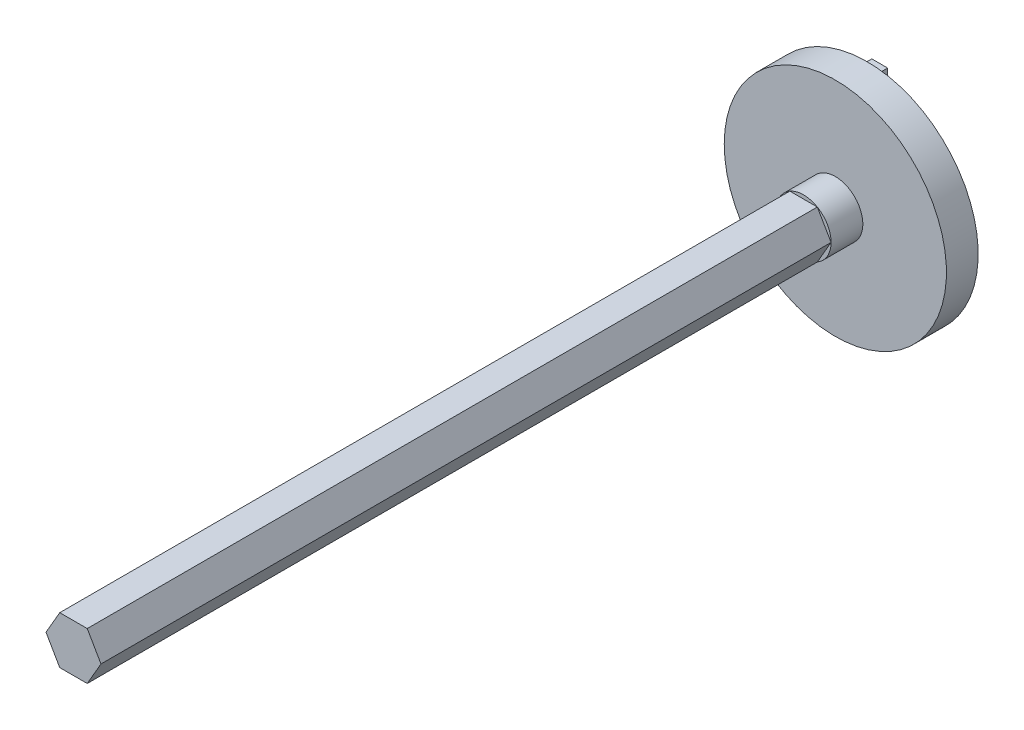
ISO-10303-21;
HEADER;
FILE_DESCRIPTION(('STEP AP214'),'2;1');
FILE_NAME('part.step','',(''),(''),'','','');
FILE_SCHEMA(('AUTOMOTIVE_DESIGN { 1 0 10303 214 1 1 1 1 }'));
ENDSEC;
DATA;
#1=APPLICATION_CONTEXT('core data for automotive mechanical design processes');
#2=APPLICATION_PROTOCOL_DEFINITION('international standard','automotive_design',2000,#1);
#3=PRODUCT_CONTEXT('',#1,'mechanical');
#4=PRODUCT('Part','Part','',(#3));
#5=PRODUCT_RELATED_PRODUCT_CATEGORY('part','',(#4));
#6=PRODUCT_DEFINITION_FORMATION('','',#4);
#7=PRODUCT_DEFINITION_CONTEXT('part definition',#1,'design');
#8=PRODUCT_DEFINITION('design','',#6,#7);
#9=PRODUCT_DEFINITION_SHAPE('','',#8);
#10=(LENGTH_UNIT() NAMED_UNIT(*) SI_UNIT(.MILLI.,.METRE.));
#11=(NAMED_UNIT(*) PLANE_ANGLE_UNIT() SI_UNIT($,.RADIAN.));
#12=(NAMED_UNIT(*) SI_UNIT($,.STERADIAN.) SOLID_ANGLE_UNIT());
#13=UNCERTAINTY_MEASURE_WITH_UNIT(LENGTH_MEASURE(1.E-05),#10,'distance_accuracy_value','');
#14=(GEOMETRIC_REPRESENTATION_CONTEXT(3) GLOBAL_UNCERTAINTY_ASSIGNED_CONTEXT((#13)) GLOBAL_UNIT_ASSIGNED_CONTEXT((#10,
#11,#12)) REPRESENTATION_CONTEXT('',''));
#15=CARTESIAN_POINT('',(0.,0.,0.));
#16=DIRECTION('',(0.,0.,1.));
#17=DIRECTION('',(1.,0.,0.));
#18=AXIS2_PLACEMENT_3D('',#15,#16,#17);
#19=CARTESIAN_POINT('',(0.,0.,-12.7));
#20=DIRECTION('',(0.,0.,-1.));
#21=DIRECTION('',(-1.,0.,0.));
#22=AXIS2_PLACEMENT_3D('',#19,#20,#21);
#23=PLANE('',#22);
#24=CARTESIAN_POINT('',(0.,0.,-12.7));
#25=DIRECTION('',(0.,0.,-1.));
#26=DIRECTION('',(-1.,0.,0.));
#27=AXIS2_PLACEMENT_3D('',#24,#25,#26);
#28=CIRCLE('',#27,44.45);
#29=CARTESIAN_POINT('',(-44.45,0.,-12.7));
#30=VERTEX_POINT('',#29);
#31=EDGE_CURVE('E152',#30,#30,#28,.T.);
#32=ORIENTED_EDGE('',*,*,#31,.T.);
#33=EDGE_LOOP('',(#32));
#34=FACE_BOUND('',#33,.T.);
#35=DIRECTION('',(1.,0.,0.));
#36=VECTOR('',#35,1.);
#37=CARTESIAN_POINT('',(3.17500000000001,41.275,-12.7));
#38=LINE('',#37,#36);
#39=CARTESIAN_POINT('',(-3.17499999999999,41.275,-12.7));
#40=VERTEX_POINT('',#39);
#41=CARTESIAN_POINT('',(3.17500000000001,41.275,-12.7));
#42=VERTEX_POINT('',#41);
#43=EDGE_CURVE('E460',#40,#42,#38,.T.);
#44=ORIENTED_EDGE('',*,*,#43,.F.);
#45=DIRECTION('',(0.,1.,0.));
#46=VECTOR('',#45,1.);
#47=CARTESIAN_POINT('',(-3.17499999999999,41.275,-12.7));
#48=LINE('',#47,#46);
#49=CARTESIAN_POINT('',(-3.17499999999999,34.925,-12.7));
#50=VERTEX_POINT('',#49);
#51=EDGE_CURVE('E144',#50,#40,#48,.T.);
#52=ORIENTED_EDGE('',*,*,#51,.F.);
#53=DIRECTION('',(-1.,0.,0.));
#54=VECTOR('',#53,1.);
#55=CARTESIAN_POINT('',(3.17500000000001,34.925,-12.7));
#56=LINE('',#55,#54);
#57=CARTESIAN_POINT('',(3.17500000000001,34.925,-12.7));
#58=VERTEX_POINT('',#57);
#59=EDGE_CURVE('E140',#58,#50,#56,.T.);
#60=ORIENTED_EDGE('',*,*,#59,.F.);
#61=DIRECTION('',(0.,-1.,0.));
#62=VECTOR('',#61,1.);
#63=CARTESIAN_POINT('',(3.17500000000001,41.275,-12.7));
#64=LINE('',#63,#62);
#65=EDGE_CURVE('E456',#42,#58,#64,.T.);
#66=ORIENTED_EDGE('',*,*,#65,.F.);
#67=EDGE_LOOP('',(#44,#52,#60,#66));
#68=FACE_BOUND('',#67,.T.);
#69=ADVANCED_FACE('F39',(#34,#68),#23,.T.);
#70=CARTESIAN_POINT('',(5.49926131403118,9.525,304.8));
#71=DIRECTION('',(0.,-1.,0.));
#72=DIRECTION('',(0.,0.,-1.));
#73=AXIS2_PLACEMENT_3D('',#70,#71,#72);
#74=PLANE('',#73);
#75=DIRECTION('',(1.,0.,0.));
#76=VECTOR('',#75,1.);
#77=CARTESIAN_POINT('',(5.49926131403118,9.525,12.7));
#78=LINE('',#77,#76);
#79=CARTESIAN_POINT('',(-5.49926131403119,9.525,12.7000000000001));
#80=VERTEX_POINT('',#79);
#81=CARTESIAN_POINT('',(5.49926131403118,9.525,12.7000000000001));
#82=VERTEX_POINT('',#81);
#83=EDGE_CURVE('E63',#80,#82,#78,.T.);
#84=ORIENTED_EDGE('',*,*,#83,.F.);
#85=DIRECTION('',(0.,0.,-1.));
#86=VECTOR('',#85,1.);
#87=CARTESIAN_POINT('',(-5.49926131403119,9.525,304.8));
#88=LINE('',#87,#86);
#89=CARTESIAN_POINT('',(-5.49926131403119,9.525,304.8));
#90=VERTEX_POINT('',#89);
#91=EDGE_CURVE('E48',#90,#80,#88,.T.);
#92=ORIENTED_EDGE('',*,*,#91,.F.);
#93=DIRECTION('',(-1.,0.,0.));
#94=VECTOR('',#93,1.);
#95=CARTESIAN_POINT('',(5.49926131403118,9.525,304.8));
#96=LINE('',#95,#94);
#97=CARTESIAN_POINT('',(5.49926131403118,9.525,304.8));
#98=VERTEX_POINT('',#97);
#99=EDGE_CURVE('E188',#98,#90,#96,.T.);
#100=ORIENTED_EDGE('',*,*,#99,.F.);
#101=DIRECTION('',(0.,0.,-1.));
#102=VECTOR('',#101,1.);
#103=CARTESIAN_POINT('',(5.49926131403118,9.525,304.8));
#104=LINE('',#103,#102);
#105=EDGE_CURVE('E207',#98,#82,#104,.T.);
#106=ORIENTED_EDGE('',*,*,#105,.T.);
#107=EDGE_LOOP('',(#84,#92,#100,#106));
#108=FACE_BOUND('',#107,.T.);
#109=ADVANCED_FACE('F41',(#108),#74,.F.);
#110=CARTESIAN_POINT('',(-5.49926131403119,9.525,304.8));
#111=DIRECTION('',(0.866025403784439,-0.5,0.));
#112=DIRECTION('',(0.5,0.866025403784439,0.));
#113=AXIS2_PLACEMENT_3D('',#110,#111,#112);
#114=PLANE('',#113);
#115=DIRECTION('',(0.5,0.866025403784439,0.));
#116=VECTOR('',#115,1.);
#117=CARTESIAN_POINT('',(-5.49926131403119,9.525,12.7));
#118=LINE('',#117,#116);
#119=CARTESIAN_POINT('',(-10.9985226280624,0.,12.7000000000001));
#120=VERTEX_POINT('',#119);
#121=EDGE_CURVE('E182',#120,#80,#118,.T.);
#122=ORIENTED_EDGE('',*,*,#121,.F.);
#123=DIRECTION('',(0.,0.,-1.));
#124=VECTOR('',#123,1.);
#125=CARTESIAN_POINT('',(-10.9985226280624,0.,304.8));
#126=LINE('',#125,#124);
#127=CARTESIAN_POINT('',(-10.9985226280624,0.,304.8));
#128=VERTEX_POINT('',#127);
#129=EDGE_CURVE('E221',#128,#120,#126,.T.);
#130=ORIENTED_EDGE('',*,*,#129,.F.);
#131=DIRECTION('',(-0.5,-0.866025403784439,0.));
#132=VECTOR('',#131,1.);
#133=CARTESIAN_POINT('',(-5.49926131403119,9.525,304.8));
#134=LINE('',#133,#132);
#135=EDGE_CURVE('E192',#90,#128,#134,.T.);
#136=ORIENTED_EDGE('',*,*,#135,.F.);
#137=ORIENTED_EDGE('',*,*,#91,.T.);
#138=EDGE_LOOP('',(#122,#130,#136,#137));
#139=FACE_BOUND('',#138,.T.);
#140=ADVANCED_FACE('F226',(#139),#114,.F.);
#141=CARTESIAN_POINT('',(-10.9985226280624,0.,304.8));
#142=DIRECTION('',(0.866025403784439,0.5,0.));
#143=DIRECTION('',(-0.5,0.866025403784438,0.));
#144=AXIS2_PLACEMENT_3D('',#141,#142,#143);
#145=PLANE('',#144);
#146=DIRECTION('',(-0.5,0.866025403784438,0.));
#147=VECTOR('',#146,1.);
#148=CARTESIAN_POINT('',(-10.9985226280624,0.,12.7));
#149=LINE('',#148,#147);
#150=CARTESIAN_POINT('',(-5.49926131403118,-9.525,12.7000000000001));
#151=VERTEX_POINT('',#150);
#152=EDGE_CURVE('E178',#151,#120,#149,.T.);
#153=ORIENTED_EDGE('',*,*,#152,.F.);
#154=DIRECTION('',(0.,0.,-1.));
#155=VECTOR('',#154,1.);
#156=CARTESIAN_POINT('',(-5.49926131403118,-9.525,304.8));
#157=LINE('',#156,#155);
#158=CARTESIAN_POINT('',(-5.49926131403118,-9.525,304.8));
#159=VERTEX_POINT('',#158);
#160=EDGE_CURVE('E217',#159,#151,#157,.T.);
#161=ORIENTED_EDGE('',*,*,#160,.F.);
#162=DIRECTION('',(0.5,-0.866025403784439,0.));
#163=VECTOR('',#162,1.);
#164=CARTESIAN_POINT('',(-10.9985226280624,0.,304.8));
#165=LINE('',#164,#163);
#166=EDGE_CURVE('E195',#128,#159,#165,.T.);
#167=ORIENTED_EDGE('',*,*,#166,.F.);
#168=ORIENTED_EDGE('',*,*,#129,.T.);
#169=EDGE_LOOP('',(#153,#161,#167,#168));
#170=FACE_BOUND('',#169,.T.);
#171=ADVANCED_FACE('F279',(#170),#145,.F.);
#172=CARTESIAN_POINT('',(-5.49926131403118,-9.525,304.8));
#173=DIRECTION('',(0.,1.,0.));
#174=DIRECTION('',(0.,0.,1.));
#175=AXIS2_PLACEMENT_3D('',#172,#173,#174);
#176=PLANE('',#175);
#177=DIRECTION('',(-1.,0.,0.));
#178=VECTOR('',#177,1.);
#179=CARTESIAN_POINT('',(-5.49926131403118,-9.525,12.7));
#180=LINE('',#179,#178);
#181=CARTESIAN_POINT('',(5.49926131403119,-9.525,12.7000000000001));
#182=VERTEX_POINT('',#181);
#183=EDGE_CURVE('E174',#182,#151,#180,.T.);
#184=ORIENTED_EDGE('',*,*,#183,.F.);
#185=DIRECTION('',(0.,0.,-1.));
#186=VECTOR('',#185,1.);
#187=CARTESIAN_POINT('',(5.49926131403119,-9.525,304.8));
#188=LINE('',#187,#186);
#189=CARTESIAN_POINT('',(5.49926131403119,-9.525,304.8));
#190=VERTEX_POINT('',#189);
#191=EDGE_CURVE('E213',#190,#182,#188,.T.);
#192=ORIENTED_EDGE('',*,*,#191,.F.);
#193=DIRECTION('',(1.,0.,0.));
#194=VECTOR('',#193,1.);
#195=CARTESIAN_POINT('',(-5.49926131403118,-9.525,304.8));
#196=LINE('',#195,#194);
#197=EDGE_CURVE('E198',#159,#190,#196,.T.);
#198=ORIENTED_EDGE('',*,*,#197,.F.);
#199=ORIENTED_EDGE('',*,*,#160,.T.);
#200=EDGE_LOOP('',(#184,#192,#198,#199));
#201=FACE_BOUND('',#200,.T.);
#202=ADVANCED_FACE('F269',(#201),#176,.F.);
#203=CARTESIAN_POINT('',(5.49926131403119,-9.525,304.8));
#204=DIRECTION('',(-0.866025403784439,0.5,0.));
#205=DIRECTION('',(-0.5,-0.866025403784439,0.));
#206=AXIS2_PLACEMENT_3D('',#203,#204,#205);
#207=PLANE('',#206);
#208=DIRECTION('',(-0.5,-0.866025403784439,0.));
#209=VECTOR('',#208,1.);
#210=CARTESIAN_POINT('',(5.49926131403119,-9.525,12.7));
#211=LINE('',#210,#209);
#212=CARTESIAN_POINT('',(10.9985226280624,0.,12.7));
#213=VERTEX_POINT('',#212);
#214=EDGE_CURVE('E165',#213,#182,#211,.T.);
#215=ORIENTED_EDGE('',*,*,#214,.F.);
#216=DIRECTION('',(0.,0.,-1.));
#217=VECTOR('',#216,1.);
#218=CARTESIAN_POINT('',(10.9985226280624,0.,304.8));
#219=LINE('',#218,#217);
#220=CARTESIAN_POINT('',(10.9985226280624,0.,304.8));
#221=VERTEX_POINT('',#220);
#222=EDGE_CURVE('E210',#221,#213,#219,.T.);
#223=ORIENTED_EDGE('',*,*,#222,.F.);
#224=DIRECTION('',(0.5,0.866025403784439,0.));
#225=VECTOR('',#224,1.);
#226=CARTESIAN_POINT('',(5.49926131403119,-9.525,304.8));
#227=LINE('',#226,#225);
#228=EDGE_CURVE('E201',#190,#221,#227,.T.);
#229=ORIENTED_EDGE('',*,*,#228,.F.);
#230=ORIENTED_EDGE('',*,*,#191,.T.);
#231=EDGE_LOOP('',(#215,#223,#229,#230));
#232=FACE_BOUND('',#231,.T.);
#233=ADVANCED_FACE('F273',(#232),#207,.F.);
#234=CARTESIAN_POINT('',(10.9985226280624,0.,304.8));
#235=DIRECTION('',(-0.866025403784439,-0.5,0.));
#236=DIRECTION('',(0.5,-0.866025403784439,0.));
#237=AXIS2_PLACEMENT_3D('',#234,#235,#236);
#238=PLANE('',#237);
#239=DIRECTION('',(0.5,-0.866025403784439,0.));
#240=VECTOR('',#239,1.);
#241=CARTESIAN_POINT('',(10.9985226280624,0.,12.7));
#242=LINE('',#241,#240);
#243=EDGE_CURVE('E11',#82,#213,#242,.T.);
#244=ORIENTED_EDGE('',*,*,#243,.F.);
#245=ORIENTED_EDGE('',*,*,#105,.F.);
#246=DIRECTION('',(-0.5,0.866025403784439,0.));
#247=VECTOR('',#246,1.);
#248=CARTESIAN_POINT('',(10.9985226280624,0.,304.8));
#249=LINE('',#248,#247);
#250=EDGE_CURVE('E204',#221,#98,#249,.T.);
#251=ORIENTED_EDGE('',*,*,#250,.F.);
#252=ORIENTED_EDGE('',*,*,#222,.T.);
#253=EDGE_LOOP('',(#244,#245,#251,#252));
#254=FACE_BOUND('',#253,.T.);
#255=ADVANCED_FACE('F320',(#254),#238,.F.);
#256=CARTESIAN_POINT('',(0.,0.,304.8));
#257=DIRECTION('',(0.,0.,1.));
#258=DIRECTION('',(1.,0.,0.));
#259=AXIS2_PLACEMENT_3D('',#256,#257,#258);
#260=PLANE('',#259);
#261=ORIENTED_EDGE('',*,*,#99,.T.);
#262=ORIENTED_EDGE('',*,*,#135,.T.);
#263=ORIENTED_EDGE('',*,*,#166,.T.);
#264=ORIENTED_EDGE('',*,*,#197,.T.);
#265=ORIENTED_EDGE('',*,*,#228,.T.);
#266=ORIENTED_EDGE('',*,*,#250,.T.);
#267=EDGE_LOOP('',(#261,#262,#263,#264,#265,#266));
#268=FACE_BOUND('',#267,.T.);
#269=ADVANCED_FACE('F276',(#268),#260,.T.);
#270=CARTESIAN_POINT('',(0.,0.,12.7));
#271=DIRECTION('',(0.,0.,-1.));
#272=DIRECTION('',(-1.,0.,0.));
#273=AXIS2_PLACEMENT_3D('',#270,#271,#272);
#274=PLANE('',#273);
#275=CARTESIAN_POINT('',(0.,0.,12.7));
#276=DIRECTION('',(0.,0.,-1.));
#277=DIRECTION('',(-1.,0.,0.));
#278=AXIS2_PLACEMENT_3D('',#275,#276,#277);
#279=CIRCLE('',#278,10.9985226280624);
#280=EDGE_CURVE('E166',#80,#82,#279,.T.);
#281=ORIENTED_EDGE('',*,*,#280,.F.);
#282=ORIENTED_EDGE('',*,*,#83,.T.);
#283=EDGE_LOOP('',(#281,#282));
#284=FACE_BOUND('',#283,.T.);
#285=ADVANCED_FACE('F235',(#284),#274,.F.);
#286=EDGE_CURVE('E161',#120,#80,#279,.T.);
#287=ORIENTED_EDGE('',*,*,#286,.F.);
#288=ORIENTED_EDGE('',*,*,#121,.T.);
#289=EDGE_LOOP('',(#287,#288));
#290=FACE_BOUND('',#289,.T.);
#291=ADVANCED_FACE('F232',(#290),#274,.F.);
#292=EDGE_CURVE('E167',#151,#120,#279,.T.);
#293=ORIENTED_EDGE('',*,*,#292,.F.);
#294=ORIENTED_EDGE('',*,*,#152,.T.);
#295=EDGE_LOOP('',(#293,#294));
#296=FACE_BOUND('',#295,.T.);
#297=ADVANCED_FACE('F280',(#296),#274,.F.);
#298=EDGE_CURVE('E248',#182,#151,#279,.T.);
#299=ORIENTED_EDGE('',*,*,#298,.F.);
#300=ORIENTED_EDGE('',*,*,#183,.T.);
#301=EDGE_LOOP('',(#299,#300));
#302=FACE_BOUND('',#301,.T.);
#303=ADVANCED_FACE('F266',(#302),#274,.F.);
#304=EDGE_CURVE('E252',#213,#182,#279,.T.);
#305=ORIENTED_EDGE('',*,*,#304,.F.);
#306=ORIENTED_EDGE('',*,*,#214,.T.);
#307=EDGE_LOOP('',(#305,#306));
#308=FACE_BOUND('',#307,.T.);
#309=ADVANCED_FACE('F261',(#308),#274,.F.);
#310=EDGE_CURVE('E240',#82,#213,#279,.T.);
#311=ORIENTED_EDGE('',*,*,#310,.F.);
#312=ORIENTED_EDGE('',*,*,#243,.T.);
#313=EDGE_LOOP('',(#311,#312));
#314=FACE_BOUND('',#313,.T.);
#315=ADVANCED_FACE('F257',(#314),#274,.F.);
#316=CARTESIAN_POINT('',(0.,0.,12.7));
#317=DIRECTION('',(0.,0.,-1.));
#318=DIRECTION('',(-1.,0.,0.));
#319=AXIS2_PLACEMENT_3D('',#316,#317,#318);
#320=CYLINDRICAL_SURFACE('',#319,10.9985226280624);
#321=ORIENTED_EDGE('',*,*,#286,.T.);
#322=ORIENTED_EDGE('',*,*,#280,.T.);
#323=ORIENTED_EDGE('',*,*,#310,.T.);
#324=ORIENTED_EDGE('',*,*,#304,.T.);
#325=ORIENTED_EDGE('',*,*,#298,.T.);
#326=ORIENTED_EDGE('',*,*,#292,.T.);
#327=EDGE_LOOP('',(#321,#322,#323,#324,#325,#326));
#328=FACE_BOUND('',#327,.T.);
#329=CARTESIAN_POINT('',(0.,0.,0.));
#330=DIRECTION('',(0.,0.,-1.));
#331=DIRECTION('',(-1.,0.,0.));
#332=AXIS2_PLACEMENT_3D('',#329,#330,#331);
#333=CIRCLE('',#332,10.9985226280624);
#334=CARTESIAN_POINT('',(-10.9985226280624,0.,0.));
#335=VERTEX_POINT('',#334);
#336=EDGE_CURVE('E159',#335,#335,#333,.T.);
#337=ORIENTED_EDGE('',*,*,#336,.F.);
#338=EDGE_LOOP('',(#337));
#339=FACE_BOUND('',#338,.T.);
#340=ADVANCED_FACE('F242',(#328,#339),#320,.T.);
#341=CARTESIAN_POINT('',(0.,0.,-12.7));
#342=DIRECTION('',(0.,0.,1.));
#343=DIRECTION('',(1.,0.,0.));
#344=AXIS2_PLACEMENT_3D('',#341,#342,#343);
#345=CYLINDRICAL_SURFACE('',#344,44.45);
#346=ORIENTED_EDGE('',*,*,#31,.F.);
#347=EDGE_LOOP('',(#346));
#348=FACE_BOUND('',#347,.T.);
#349=CARTESIAN_POINT('',(0.,0.,0.));
#350=DIRECTION('',(0.,0.,-1.));
#351=DIRECTION('',(-1.,0.,0.));
#352=AXIS2_PLACEMENT_3D('',#349,#350,#351);
#353=CIRCLE('',#352,44.45);
#354=CARTESIAN_POINT('',(-44.45,0.,0.));
#355=VERTEX_POINT('',#354);
#356=EDGE_CURVE('E147',#355,#355,#353,.T.);
#357=ORIENTED_EDGE('',*,*,#356,.T.);
#358=EDGE_LOOP('',(#357));
#359=FACE_BOUND('',#358,.T.);
#360=ADVANCED_FACE('F303',(#348,#359),#345,.T.);
#361=CARTESIAN_POINT('',(0.,0.,0.));
#362=DIRECTION('',(0.,0.,-1.));
#363=DIRECTION('',(-1.,0.,0.));
#364=AXIS2_PLACEMENT_3D('',#361,#362,#363);
#365=PLANE('',#364);
#366=ORIENTED_EDGE('',*,*,#336,.T.);
#367=EDGE_LOOP('',(#366));
#368=FACE_BOUND('',#367,.T.);
#369=ORIENTED_EDGE('',*,*,#356,.F.);
#370=EDGE_LOOP('',(#369));
#371=FACE_BOUND('',#370,.T.);
#372=ADVANCED_FACE('F301',(#368,#371),#365,.F.);
#373=CARTESIAN_POINT('',(-3.17499999999999,41.275,-17.78));
#374=DIRECTION('',(1.,0.,0.));
#375=DIRECTION('',(0.,1.,0.));
#376=AXIS2_PLACEMENT_3D('',#373,#374,#375);
#377=PLANE('',#376);
#378=ORIENTED_EDGE('',*,*,#51,.T.);
#379=DIRECTION('',(0.,0.,1.));
#380=VECTOR('',#379,1.);
#381=CARTESIAN_POINT('',(-3.17499999999999,41.275,-17.78));
#382=LINE('',#381,#380);
#383=CARTESIAN_POINT('',(-3.17499999999999,41.275,-17.78));
#384=VERTEX_POINT('',#383);
#385=EDGE_CURVE('E123',#384,#40,#382,.T.);
#386=ORIENTED_EDGE('',*,*,#385,.F.);
#387=DIRECTION('',(0.,1.,0.));
#388=VECTOR('',#387,1.);
#389=CARTESIAN_POINT('',(-3.17499999999999,41.275,-17.78));
#390=LINE('',#389,#388);
#391=CARTESIAN_POINT('',(-3.17499999999999,34.925,-17.78));
#392=VERTEX_POINT('',#391);
#393=EDGE_CURVE('E131',#392,#384,#390,.T.);
#394=ORIENTED_EDGE('',*,*,#393,.F.);
#395=DIRECTION('',(0.,0.,1.));
#396=VECTOR('',#395,1.);
#397=CARTESIAN_POINT('',(-3.17499999999999,34.925,-17.78));
#398=LINE('',#397,#396);
#399=EDGE_CURVE('E453',#392,#50,#398,.T.);
#400=ORIENTED_EDGE('',*,*,#399,.T.);
#401=EDGE_LOOP('',(#378,#386,#394,#400));
#402=FACE_BOUND('',#401,.T.);
#403=ADVANCED_FACE('F142',(#402),#377,.F.);
#404=CARTESIAN_POINT('',(3.17500000000001,41.275,-17.78));
#405=DIRECTION('',(0.,-1.,0.));
#406=DIRECTION('',(0.,0.,-1.));
#407=AXIS2_PLACEMENT_3D('',#404,#405,#406);
#408=PLANE('',#407);
#409=ORIENTED_EDGE('',*,*,#43,.T.);
#410=DIRECTION('',(0.,0.,1.));
#411=VECTOR('',#410,1.);
#412=CARTESIAN_POINT('',(3.17500000000001,41.275,-17.78));
#413=LINE('',#412,#411);
#414=CARTESIAN_POINT('',(3.17500000000001,41.275,-17.78));
#415=VERTEX_POINT('',#414);
#416=EDGE_CURVE('E126',#415,#42,#413,.T.);
#417=ORIENTED_EDGE('',*,*,#416,.F.);
#418=DIRECTION('',(1.,0.,0.));
#419=VECTOR('',#418,1.);
#420=CARTESIAN_POINT('',(3.17500000000001,41.275,-17.78));
#421=LINE('',#420,#419);
#422=EDGE_CURVE('E119',#384,#415,#421,.T.);
#423=ORIENTED_EDGE('',*,*,#422,.F.);
#424=ORIENTED_EDGE('',*,*,#385,.T.);
#425=EDGE_LOOP('',(#409,#417,#423,#424));
#426=FACE_BOUND('',#425,.T.);
#427=ADVANCED_FACE('F121',(#426),#408,.F.);
#428=CARTESIAN_POINT('',(3.17500000000001,41.275,-17.78));
#429=DIRECTION('',(-1.,0.,0.));
#430=DIRECTION('',(0.,-1.,0.));
#431=AXIS2_PLACEMENT_3D('',#428,#429,#430);
#432=PLANE('',#431);
#433=ORIENTED_EDGE('',*,*,#65,.T.);
#434=DIRECTION('',(0.,0.,1.));
#435=VECTOR('',#434,1.);
#436=CARTESIAN_POINT('',(3.17500000000001,34.925,-17.78));
#437=LINE('',#436,#435);
#438=CARTESIAN_POINT('',(3.17500000000001,34.925,-17.78));
#439=VERTEX_POINT('',#438);
#440=EDGE_CURVE('E55',#439,#58,#437,.T.);
#441=ORIENTED_EDGE('',*,*,#440,.F.);
#442=DIRECTION('',(0.,-1.,0.));
#443=VECTOR('',#442,1.);
#444=CARTESIAN_POINT('',(3.17500000000001,41.275,-17.78));
#445=LINE('',#444,#443);
#446=EDGE_CURVE('E130',#415,#439,#445,.T.);
#447=ORIENTED_EDGE('',*,*,#446,.F.);
#448=ORIENTED_EDGE('',*,*,#416,.T.);
#449=EDGE_LOOP('',(#433,#441,#447,#448));
#450=FACE_BOUND('',#449,.T.);
#451=ADVANCED_FACE('F420',(#450),#432,.F.);
#452=CARTESIAN_POINT('',(3.17500000000001,34.925,-17.78));
#453=DIRECTION('',(0.,1.,0.));
#454=DIRECTION('',(0.,0.,1.));
#455=AXIS2_PLACEMENT_3D('',#452,#453,#454);
#456=PLANE('',#455);
#457=ORIENTED_EDGE('',*,*,#59,.T.);
#458=ORIENTED_EDGE('',*,*,#399,.F.);
#459=DIRECTION('',(-1.,0.,0.));
#460=VECTOR('',#459,1.);
#461=CARTESIAN_POINT('',(3.17500000000001,34.925,-17.78));
#462=LINE('',#461,#460);
#463=EDGE_CURVE('E135',#439,#392,#462,.T.);
#464=ORIENTED_EDGE('',*,*,#463,.F.);
#465=ORIENTED_EDGE('',*,*,#440,.T.);
#466=EDGE_LOOP('',(#457,#458,#464,#465));
#467=FACE_BOUND('',#466,.T.);
#468=ADVANCED_FACE('F426',(#467),#456,.F.);
#469=CARTESIAN_POINT('',(0.,0.,-17.78));
#470=DIRECTION('',(0.,0.,-1.));
#471=DIRECTION('',(-1.,0.,0.));
#472=AXIS2_PLACEMENT_3D('',#469,#470,#471);
#473=PLANE('',#472);
#474=ORIENTED_EDGE('',*,*,#393,.T.);
#475=ORIENTED_EDGE('',*,*,#422,.T.);
#476=ORIENTED_EDGE('',*,*,#446,.T.);
#477=ORIENTED_EDGE('',*,*,#463,.T.);
#478=EDGE_LOOP('',(#474,#475,#476,#477));
#479=FACE_BOUND('',#478,.T.);
#480=ADVANCED_FACE('F134',(#479),#473,.T.);
#481=CLOSED_SHELL('',(#69,#109,#140,#171,#202,#233,#255,#269,#285,#291,#297,#303,#309,#315,#340,
#360,#372,#403,#427,#451,#468,#480));
#482=MANIFOLD_SOLID_BREP('B2',#481);
#483=ADVANCED_BREP_SHAPE_REPRESENTATION('',(#18,#482),#14);
#484=SHAPE_DEFINITION_REPRESENTATION(#9,#483);
ENDSEC;
END-ISO-10303-21;
